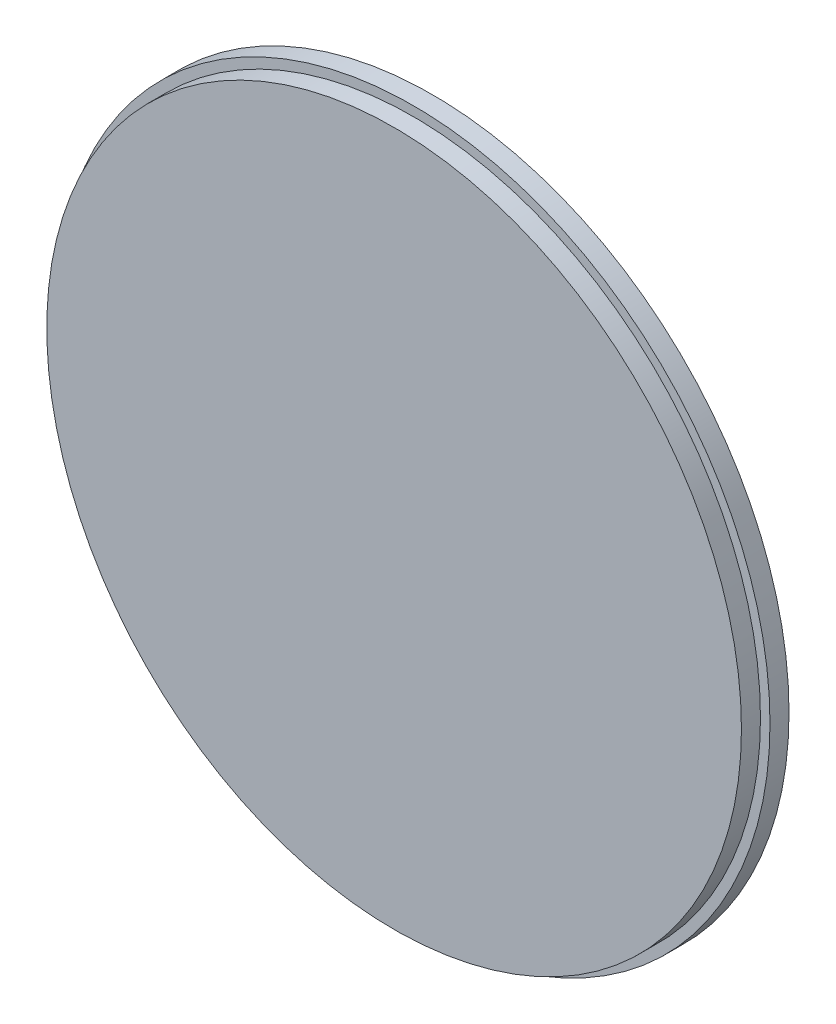
ISO-10303-21;
HEADER;
FILE_DESCRIPTION(('STEP AP214'),'2;1');
FILE_NAME('part.step','',(''),(''),'','','');
FILE_SCHEMA(('AUTOMOTIVE_DESIGN { 1 0 10303 214 1 1 1 1 }'));
ENDSEC;
DATA;
#1=APPLICATION_CONTEXT('core data for automotive mechanical design processes');
#2=APPLICATION_PROTOCOL_DEFINITION('international standard','automotive_design',2000,#1);
#3=PRODUCT_CONTEXT('',#1,'mechanical');
#4=PRODUCT('Part','Part','',(#3));
#5=PRODUCT_RELATED_PRODUCT_CATEGORY('part','',(#4));
#6=PRODUCT_DEFINITION_FORMATION('','',#4);
#7=PRODUCT_DEFINITION_CONTEXT('part definition',#1,'design');
#8=PRODUCT_DEFINITION('design','',#6,#7);
#9=PRODUCT_DEFINITION_SHAPE('','',#8);
#10=(LENGTH_UNIT() NAMED_UNIT(*) SI_UNIT(.MILLI.,.METRE.));
#11=(NAMED_UNIT(*) PLANE_ANGLE_UNIT() SI_UNIT($,.RADIAN.));
#12=(NAMED_UNIT(*) SI_UNIT($,.STERADIAN.) SOLID_ANGLE_UNIT());
#13=UNCERTAINTY_MEASURE_WITH_UNIT(LENGTH_MEASURE(1.E-05),#10,'distance_accuracy_value','');
#14=(GEOMETRIC_REPRESENTATION_CONTEXT(3) GLOBAL_UNCERTAINTY_ASSIGNED_CONTEXT((#13)) GLOBAL_UNIT_ASSIGNED_CONTEXT((#10,
#11,#12)) REPRESENTATION_CONTEXT('',''));
#15=CARTESIAN_POINT('',(0.,0.,0.));
#16=DIRECTION('',(0.,0.,1.));
#17=DIRECTION('',(1.,0.,0.));
#18=AXIS2_PLACEMENT_3D('',#15,#16,#17);
#19=CARTESIAN_POINT('',(0.,0.,1.));
#20=DIRECTION('',(0.,0.,-1.));
#21=DIRECTION('',(-1.,0.,0.));
#22=AXIS2_PLACEMENT_3D('',#19,#20,#21);
#23=CYLINDRICAL_SURFACE('',#22,18.75);
#24=CARTESIAN_POINT('',(0.,0.,1.));
#25=DIRECTION('',(0.,0.,1.));
#26=DIRECTION('',(1.,0.,0.));
#27=AXIS2_PLACEMENT_3D('',#24,#25,#26);
#28=CIRCLE('',#27,18.75);
#29=CARTESIAN_POINT('',(18.75,0.,1.));
#30=VERTEX_POINT('',#29);
#31=EDGE_CURVE('E10',#30,#30,#28,.T.);
#32=ORIENTED_EDGE('',*,*,#31,.F.);
#33=EDGE_LOOP('',(#32));
#34=FACE_BOUND('',#33,.T.);
#35=CARTESIAN_POINT('',(0.,0.,0.));
#36=DIRECTION('',(0.,0.,1.));
#37=DIRECTION('',(1.,0.,0.));
#38=AXIS2_PLACEMENT_3D('',#35,#36,#37);
#39=CIRCLE('',#38,18.75);
#40=CARTESIAN_POINT('',(18.75,0.,0.));
#41=VERTEX_POINT('',#40);
#42=EDGE_CURVE('E42',#41,#41,#39,.T.);
#43=ORIENTED_EDGE('',*,*,#42,.T.);
#44=EDGE_LOOP('',(#43));
#45=FACE_BOUND('',#44,.T.);
#46=ADVANCED_FACE('F39',(#34,#45),#23,.T.);
#47=CARTESIAN_POINT('',(0.,0.,1.));
#48=DIRECTION('',(0.,0.,1.));
#49=DIRECTION('',(1.,0.,0.));
#50=AXIS2_PLACEMENT_3D('',#47,#48,#49);
#51=PLANE('',#50);
#52=CARTESIAN_POINT('',(0.,0.,1.));
#53=DIRECTION('',(0.,0.,1.));
#54=DIRECTION('',(1.,0.,0.));
#55=AXIS2_PLACEMENT_3D('',#52,#53,#54);
#56=CIRCLE('',#55,18.25);
#57=CARTESIAN_POINT('',(18.25,0.,1.));
#58=VERTEX_POINT('',#57);
#59=EDGE_CURVE('E51',#58,#58,#56,.F.);
#60=ORIENTED_EDGE('',*,*,#59,.T.);
#61=EDGE_LOOP('',(#60));
#62=FACE_BOUND('',#61,.T.);
#63=ORIENTED_EDGE('',*,*,#31,.T.);
#64=EDGE_LOOP('',(#63));
#65=FACE_BOUND('',#64,.T.);
#66=ADVANCED_FACE('F73',(#62,#65),#51,.T.);
#67=CARTESIAN_POINT('',(0.,0.,0.));
#68=DIRECTION('',(0.,0.,1.));
#69=DIRECTION('',(1.,0.,0.));
#70=AXIS2_PLACEMENT_3D('',#67,#68,#69);
#71=PLANE('',#70);
#72=ORIENTED_EDGE('',*,*,#42,.F.);
#73=EDGE_LOOP('',(#72));
#74=FACE_BOUND('',#73,.T.);
#75=ADVANCED_FACE('F65',(#74),#71,.F.);
#76=CARTESIAN_POINT('',(0.,0.,2.));
#77=DIRECTION('',(0.,0.,-1.));
#78=DIRECTION('',(-1.,0.,0.));
#79=AXIS2_PLACEMENT_3D('',#76,#77,#78);
#80=CYLINDRICAL_SURFACE('',#79,18.25);
#81=ORIENTED_EDGE('',*,*,#59,.F.);
#82=EDGE_LOOP('',(#81));
#83=FACE_BOUND('',#82,.T.);
#84=CARTESIAN_POINT('',(0.,0.,2.));
#85=DIRECTION('',(0.,0.,1.));
#86=DIRECTION('',(1.,0.,0.));
#87=AXIS2_PLACEMENT_3D('',#84,#85,#86);
#88=CIRCLE('',#87,18.25);
#89=CARTESIAN_POINT('',(18.25,0.,2.));
#90=VERTEX_POINT('',#89);
#91=EDGE_CURVE('E56',#90,#90,#88,.T.);
#92=ORIENTED_EDGE('',*,*,#91,.F.);
#93=EDGE_LOOP('',(#92));
#94=FACE_BOUND('',#93,.T.);
#95=ADVANCED_FACE('F63',(#83,#94),#80,.T.);
#96=CARTESIAN_POINT('',(0.,0.,2.));
#97=DIRECTION('',(0.,0.,1.));
#98=DIRECTION('',(1.,0.,0.));
#99=AXIS2_PLACEMENT_3D('',#96,#97,#98);
#100=PLANE('',#99);
#101=ORIENTED_EDGE('',*,*,#91,.T.);
#102=EDGE_LOOP('',(#101));
#103=FACE_BOUND('',#102,.T.);
#104=ADVANCED_FACE('F61',(#103),#100,.T.);
#105=CLOSED_SHELL('',(#46,#66,#75,#95,#104));
#106=MANIFOLD_SOLID_BREP('B2',#105);
#107=ADVANCED_BREP_SHAPE_REPRESENTATION('',(#18,#106),#14);
#108=SHAPE_DEFINITION_REPRESENTATION(#9,#107);
ENDSEC;
END-ISO-10303-21;
